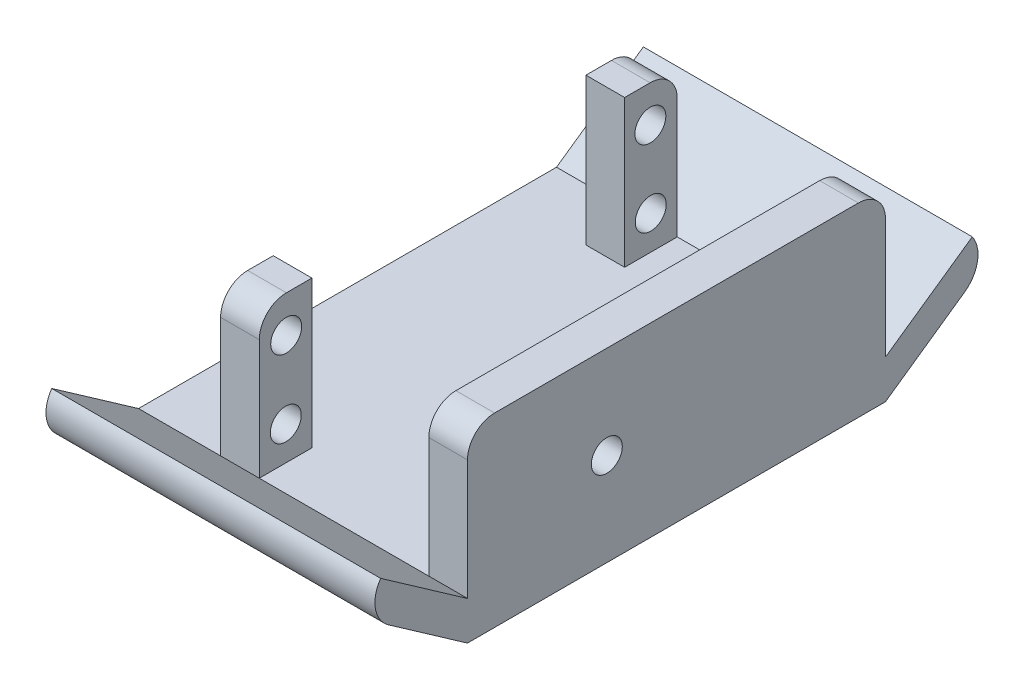
ISO-10303-21;
HEADER;
FILE_DESCRIPTION(('STEP AP214'),'2;1');
FILE_NAME('part.step','',(''),(''),'','','');
FILE_SCHEMA(('AUTOMOTIVE_DESIGN { 1 0 10303 214 1 1 1 1 }'));
ENDSEC;
DATA;
#1=APPLICATION_CONTEXT('core data for automotive mechanical design processes');
#2=APPLICATION_PROTOCOL_DEFINITION('international standard','automotive_design',2000,#1);
#3=PRODUCT_CONTEXT('',#1,'mechanical');
#4=PRODUCT('Part','Part','',(#3));
#5=PRODUCT_RELATED_PRODUCT_CATEGORY('part','',(#4));
#6=PRODUCT_DEFINITION_FORMATION('','',#4);
#7=PRODUCT_DEFINITION_CONTEXT('part definition',#1,'design');
#8=PRODUCT_DEFINITION('design','',#6,#7);
#9=PRODUCT_DEFINITION_SHAPE('','',#8);
#10=(LENGTH_UNIT() NAMED_UNIT(*) SI_UNIT(.MILLI.,.METRE.));
#11=(NAMED_UNIT(*) PLANE_ANGLE_UNIT() SI_UNIT($,.RADIAN.));
#12=(NAMED_UNIT(*) SI_UNIT($,.STERADIAN.) SOLID_ANGLE_UNIT());
#13=UNCERTAINTY_MEASURE_WITH_UNIT(LENGTH_MEASURE(1.E-05),#10,'distance_accuracy_value','');
#14=(GEOMETRIC_REPRESENTATION_CONTEXT(3) GLOBAL_UNCERTAINTY_ASSIGNED_CONTEXT((#13)) GLOBAL_UNIT_ASSIGNED_CONTEXT((#10,
#11,#12)) REPRESENTATION_CONTEXT('',''));
#15=CARTESIAN_POINT('',(0.,0.,0.));
#16=DIRECTION('',(0.,0.,1.));
#17=DIRECTION('',(1.,0.,0.));
#18=AXIS2_PLACEMENT_3D('',#15,#16,#17);
#19=CARTESIAN_POINT('',(31.9,-5.,-6.8));
#20=DIRECTION('',(0.,0.,-1.));
#21=DIRECTION('',(-1.,0.,0.));
#22=AXIS2_PLACEMENT_3D('',#19,#20,#21);
#23=PLANE('',#22);
#24=DIRECTION('',(-1.,0.,0.));
#25=VECTOR('',#24,1.);
#26=CARTESIAN_POINT('',(31.9,0.,-6.8));
#27=LINE('',#26,#25);
#28=CARTESIAN_POINT('',(5.00000000000001,0.,-6.8));
#29=VERTEX_POINT('',#28);
#30=CARTESIAN_POINT('',(0.,0.,-6.8));
#31=VERTEX_POINT('',#30);
#32=EDGE_CURVE('E207',#29,#31,#27,.T.);
#33=ORIENTED_EDGE('',*,*,#32,.T.);
#34=DIRECTION('',(0.,-1.,0.));
#35=VECTOR('',#34,1.);
#36=CARTESIAN_POINT('',(0.,19.,-6.8));
#37=LINE('',#36,#35);
#38=CARTESIAN_POINT('',(0.,15.5,-6.8));
#39=VERTEX_POINT('',#38);
#40=EDGE_CURVE('E295',#39,#31,#37,.T.);
#41=ORIENTED_EDGE('',*,*,#40,.F.);
#42=DIRECTION('',(-1.,0.,0.));
#43=VECTOR('',#42,1.);
#44=CARTESIAN_POINT('',(31.9,15.5,-6.8));
#45=LINE('',#44,#43);
#46=CARTESIAN_POINT('',(5.00000000000001,15.5,-6.8));
#47=VERTEX_POINT('',#46);
#48=EDGE_CURVE('E332',#39,#47,#45,.F.);
#49=ORIENTED_EDGE('',*,*,#48,.T.);
#50=DIRECTION('',(0.,-1.,0.));
#51=VECTOR('',#50,1.);
#52=CARTESIAN_POINT('',(5.00000000000001,19.,-6.8));
#53=LINE('',#52,#51);
#54=EDGE_CURVE('E280',#47,#29,#53,.T.);
#55=ORIENTED_EDGE('',*,*,#54,.T.);
#56=EDGE_LOOP('',(#33,#41,#49,#55));
#57=FACE_BOUND('',#56,.T.);
#58=ADVANCED_FACE('F33',(#57),#23,.T.);
#59=CARTESIAN_POINT('',(31.9,-5.,47.2));
#60=DIRECTION('',(0.,0.,1.));
#61=DIRECTION('',(1.,0.,0.));
#62=AXIS2_PLACEMENT_3D('',#59,#60,#61);
#63=PLANE('',#62);
#64=DIRECTION('',(-1.,0.,0.));
#65=VECTOR('',#64,1.);
#66=CARTESIAN_POINT('',(31.9,0.,47.2));
#67=LINE('',#66,#65);
#68=CARTESIAN_POINT('',(31.9,0.,47.2));
#69=VERTEX_POINT('',#68);
#70=CARTESIAN_POINT('',(26.9,0.,47.2));
#71=VERTEX_POINT('',#70);
#72=EDGE_CURVE('E226',#69,#71,#67,.T.);
#73=ORIENTED_EDGE('',*,*,#72,.F.);
#74=DIRECTION('',(0.,1.,0.));
#75=VECTOR('',#74,1.);
#76=CARTESIAN_POINT('',(31.9,-5.,47.2));
#77=LINE('',#76,#75);
#78=CARTESIAN_POINT('',(31.9,15.5,47.2));
#79=VERTEX_POINT('',#78);
#80=EDGE_CURVE('E319',#69,#79,#77,.T.);
#81=ORIENTED_EDGE('',*,*,#80,.T.);
#82=DIRECTION('',(1.,0.,0.));
#83=VECTOR('',#82,1.);
#84=CARTESIAN_POINT('',(26.9,15.5,47.2));
#85=LINE('',#84,#83);
#86=CARTESIAN_POINT('',(26.9,15.5,47.2));
#87=VERTEX_POINT('',#86);
#88=EDGE_CURVE('E354',#79,#87,#85,.F.);
#89=ORIENTED_EDGE('',*,*,#88,.T.);
#90=DIRECTION('',(0.,-1.,0.));
#91=VECTOR('',#90,1.);
#92=CARTESIAN_POINT('',(26.9,19.,47.2));
#93=LINE('',#92,#91);
#94=EDGE_CURVE('E239',#87,#71,#93,.T.);
#95=ORIENTED_EDGE('',*,*,#94,.T.);
#96=EDGE_LOOP('',(#73,#81,#89,#95));
#97=FACE_BOUND('',#96,.T.);
#98=ADVANCED_FACE('F436',(#97),#63,.T.);
#99=CARTESIAN_POINT('',(0.,0.,0.));
#100=DIRECTION('',(0.,1.,0.));
#101=DIRECTION('',(0.,0.,1.));
#102=AXIS2_PLACEMENT_3D('',#99,#100,#101);
#103=PLANE('',#102);
#104=DIRECTION('',(1.,0.,0.));
#105=VECTOR('',#104,1.);
#106=CARTESIAN_POINT('',(31.9,0.,47.2));
#107=LINE('',#106,#105);
#108=CARTESIAN_POINT('',(5.00000000000001,0.,47.2));
#109=VERTEX_POINT('',#108);
#110=EDGE_CURVE('E316',#109,#71,#107,.T.);
#111=ORIENTED_EDGE('',*,*,#110,.T.);
#112=DIRECTION('',(0.,0.,1.));
#113=VECTOR('',#112,1.);
#114=CARTESIAN_POINT('',(26.9,0.,-6.8));
#115=LINE('',#114,#113);
#116=CARTESIAN_POINT('',(26.9,0.,-6.8));
#117=VERTEX_POINT('',#116);
#118=EDGE_CURVE('E229',#117,#71,#115,.T.);
#119=ORIENTED_EDGE('',*,*,#118,.F.);
#120=DIRECTION('',(-1.,0.,0.));
#121=VECTOR('',#120,1.);
#122=CARTESIAN_POINT('',(31.9,0.,-6.8));
#123=LINE('',#122,#121);
#124=EDGE_CURVE('E311',#117,#29,#123,.T.);
#125=ORIENTED_EDGE('',*,*,#124,.T.);
#126=DIRECTION('',(0.,0.,-1.));
#127=VECTOR('',#126,1.);
#128=CARTESIAN_POINT('',(5.00000000000001,0.,0.));
#129=LINE('',#128,#127);
#130=CARTESIAN_POINT('',(5.00000000000001,0.,0.));
#131=VERTEX_POINT('',#130);
#132=EDGE_CURVE('E275',#131,#29,#129,.T.);
#133=ORIENTED_EDGE('',*,*,#132,.F.);
#134=DIRECTION('',(1.,0.,0.));
#135=VECTOR('',#134,1.);
#136=CARTESIAN_POINT('',(0.,0.,0.));
#137=LINE('',#136,#135);
#138=CARTESIAN_POINT('',(0.,0.,0.));
#139=VERTEX_POINT('',#138);
#140=EDGE_CURVE('E283',#139,#131,#137,.T.);
#141=ORIENTED_EDGE('',*,*,#140,.F.);
#142=DIRECTION('',(0.,0.,1.));
#143=VECTOR('',#142,1.);
#144=CARTESIAN_POINT('',(0.,0.,0.));
#145=LINE('',#144,#143);
#146=EDGE_CURVE('E271',#31,#139,#145,.T.);
#147=ORIENTED_EDGE('',*,*,#146,.F.);
#148=CARTESIAN_POINT('',(-10.6,0.,-6.8));
#149=VERTEX_POINT('',#148);
#150=EDGE_CURVE('E298',#31,#149,#123,.T.);
#151=ORIENTED_EDGE('',*,*,#150,.T.);
#152=DIRECTION('',(0.,0.,1.));
#153=VECTOR('',#152,1.);
#154=CARTESIAN_POINT('',(-10.6,0.,47.2));
#155=LINE('',#154,#153);
#156=CARTESIAN_POINT('',(-10.6,0.,47.2));
#157=VERTEX_POINT('',#156);
#158=EDGE_CURVE('E314',#149,#157,#155,.T.);
#159=ORIENTED_EDGE('',*,*,#158,.T.);
#160=CARTESIAN_POINT('',(0.,0.,47.2));
#161=VERTEX_POINT('',#160);
#162=EDGE_CURVE('E302',#157,#161,#107,.T.);
#163=ORIENTED_EDGE('',*,*,#162,.T.);
#164=DIRECTION('',(0.,0.,1.));
#165=VECTOR('',#164,1.);
#166=CARTESIAN_POINT('',(0.,0.,40.4));
#167=LINE('',#166,#165);
#168=CARTESIAN_POINT('',(0.,0.,40.4));
#169=VERTEX_POINT('',#168);
#170=EDGE_CURVE('E246',#169,#161,#167,.T.);
#171=ORIENTED_EDGE('',*,*,#170,.F.);
#172=DIRECTION('',(-1.,0.,0.));
#173=VECTOR('',#172,1.);
#174=CARTESIAN_POINT('',(0.,0.,40.4));
#175=LINE('',#174,#173);
#176=CARTESIAN_POINT('',(5.00000000000001,0.,40.4));
#177=VERTEX_POINT('',#176);
#178=EDGE_CURVE('E251',#177,#169,#175,.T.);
#179=ORIENTED_EDGE('',*,*,#178,.F.);
#180=DIRECTION('',(0.,0.,-1.));
#181=VECTOR('',#180,1.);
#182=CARTESIAN_POINT('',(5.00000000000001,0.,40.4));
#183=LINE('',#182,#181);
#184=EDGE_CURVE('E258',#109,#177,#183,.T.);
#185=ORIENTED_EDGE('',*,*,#184,.F.);
#186=EDGE_LOOP('',(#111,#119,#125,#133,#141,#147,#151,#159,#163,#171,#179,#185));
#187=FACE_BOUND('',#186,.T.);
#188=ADVANCED_FACE('F385',(#187),#103,.T.);
#189=CARTESIAN_POINT('',(31.9,-5.,47.2));
#190=DIRECTION('',(1.,0.,0.));
#191=DIRECTION('',(0.,0.,-1.));
#192=AXIS2_PLACEMENT_3D('',#189,#190,#191);
#193=PLANE('',#192);
#194=CARTESIAN_POINT('',(31.9,7.,29.2));
#195=DIRECTION('',(1.,0.,0.));
#196=DIRECTION('',(0.,0.,-1.));
#197=AXIS2_PLACEMENT_3D('',#194,#195,#196);
#198=CIRCLE('',#197,2.);
#199=CARTESIAN_POINT('',(31.9,7.,27.2));
#200=VERTEX_POINT('',#199);
#201=EDGE_CURVE('E420',#200,#200,#198,.T.);
#202=ORIENTED_EDGE('',*,*,#201,.F.);
#203=EDGE_LOOP('',(#202));
#204=FACE_BOUND('',#203,.T.);
#205=DIRECTION('',(0.,-0.57357643635105,-0.819152044288989));
#206=VECTOR('',#205,1.);
#207=CARTESIAN_POINT('',(31.9,7.85505035831426,58.4181745120853));
#208=LINE('',#207,#206);
#209=CARTESIAN_POINT('',(31.9,7.85505035831426,58.4181745120853));
#210=VERTEX_POINT('',#209);
#211=EDGE_CURVE('E216',#210,#69,#208,.T.);
#212=ORIENTED_EDGE('',*,*,#211,.F.);
#213=CARTESIAN_POINT('',(31.9,5.50686124991796,55.0572210891398));
#214=DIRECTION('',(1.,0.,0.));
#215=DIRECTION('',(0.,0.,-1.));
#216=AXIS2_PLACEMENT_3D('',#213,#214,#215);
#217=CIRCLE('',#216,4.1);
#218=CARTESIAN_POINT('',(31.9,2.14833786833309,57.4088844781791));
#219=VERTEX_POINT('',#218);
#220=EDGE_CURVE('E41',#210,#219,#217,.T.);
#221=ORIENTED_EDGE('',*,*,#220,.T.);
#222=DIRECTION('',(0.,0.573576436351044,0.819152044288993));
#223=VECTOR('',#222,1.);
#224=CARTESIAN_POINT('',(31.9,-5.,47.2));
#225=LINE('',#224,#223);
#226=CARTESIAN_POINT('',(31.9,-5.,47.2));
#227=VERTEX_POINT('',#226);
#228=EDGE_CURVE('E213',#227,#219,#225,.T.);
#229=ORIENTED_EDGE('',*,*,#228,.F.);
#230=DIRECTION('',(0.,0.,-1.));
#231=VECTOR('',#230,1.);
#232=CARTESIAN_POINT('',(31.9,-5.,47.2));
#233=LINE('',#232,#231);
#234=CARTESIAN_POINT('',(31.9,-5.,-6.8));
#235=VERTEX_POINT('',#234);
#236=EDGE_CURVE('E299',#227,#235,#233,.T.);
#237=ORIENTED_EDGE('',*,*,#236,.T.);
#238=DIRECTION('',(0.,-0.573576436351044,0.819152044288993));
#239=VECTOR('',#238,1.);
#240=CARTESIAN_POINT('',(31.9,-5.00000000000002,-6.8));
#241=LINE('',#240,#239);
#242=CARTESIAN_POINT('',(31.9,2.14833786833306,-17.0088844781791));
#243=VERTEX_POINT('',#242);
#244=EDGE_CURVE('E192',#243,#235,#241,.T.);
#245=ORIENTED_EDGE('',*,*,#244,.F.);
#246=CARTESIAN_POINT('',(31.9,5.50686124991794,-14.6572210891398));
#247=DIRECTION('',(1.,0.,0.));
#248=DIRECTION('',(0.,0.,-1.));
#249=AXIS2_PLACEMENT_3D('',#246,#247,#248);
#250=CIRCLE('',#249,4.1);
#251=CARTESIAN_POINT('',(31.9,7.85505035831424,-18.0181745120853));
#252=VERTEX_POINT('',#251);
#253=EDGE_CURVE('E186',#243,#252,#250,.T.);
#254=ORIENTED_EDGE('',*,*,#253,.T.);
#255=DIRECTION('',(0.,0.57357643635105,-0.819152044288989));
#256=VECTOR('',#255,1.);
#257=CARTESIAN_POINT('',(31.9,7.85505035831424,-18.0181745120853));
#258=LINE('',#257,#256);
#259=CARTESIAN_POINT('',(31.9,0.,-6.8));
#260=VERTEX_POINT('',#259);
#261=EDGE_CURVE('E190',#260,#252,#258,.T.);
#262=ORIENTED_EDGE('',*,*,#261,.F.);
#263=DIRECTION('',(0.,1.,0.));
#264=VECTOR('',#263,1.);
#265=CARTESIAN_POINT('',(31.9,-5.,-6.8));
#266=LINE('',#265,#264);
#267=CARTESIAN_POINT('',(31.9,15.5,-6.8));
#268=VERTEX_POINT('',#267);
#269=EDGE_CURVE('E310',#260,#268,#266,.T.);
#270=ORIENTED_EDGE('',*,*,#269,.T.);
#271=CARTESIAN_POINT('',(31.9,15.5,-3.3));
#272=DIRECTION('',(1.,0.,0.));
#273=DIRECTION('',(0.,0.,-1.));
#274=AXIS2_PLACEMENT_3D('',#271,#272,#273);
#275=CIRCLE('',#274,3.5);
#276=CARTESIAN_POINT('',(31.9,19.,-3.3));
#277=VERTEX_POINT('',#276);
#278=EDGE_CURVE('E340',#268,#277,#275,.T.);
#279=ORIENTED_EDGE('',*,*,#278,.T.);
#280=DIRECTION('',(0.,0.,-1.));
#281=VECTOR('',#280,1.);
#282=CARTESIAN_POINT('',(31.9,19.,-6.8));
#283=LINE('',#282,#281);
#284=CARTESIAN_POINT('',(31.9,19.,43.7));
#285=VERTEX_POINT('',#284);
#286=EDGE_CURVE('E233',#285,#277,#283,.T.);
#287=ORIENTED_EDGE('',*,*,#286,.F.);
#288=CARTESIAN_POINT('',(31.9,15.5,43.7));
#289=DIRECTION('',(1.,0.,0.));
#290=DIRECTION('',(0.,0.,-1.));
#291=AXIS2_PLACEMENT_3D('',#288,#289,#290);
#292=CIRCLE('',#291,3.5);
#293=EDGE_CURVE('E337',#285,#79,#292,.T.);
#294=ORIENTED_EDGE('',*,*,#293,.T.);
#295=ORIENTED_EDGE('',*,*,#80,.F.);
#296=EDGE_LOOP('',(#212,#221,#229,#237,#245,#254,#262,#270,#279,#287,#294,#295));
#297=FACE_BOUND('',#296,.T.);
#298=ADVANCED_FACE('F189',(#204,#297),#193,.T.);
#299=EDGE_CURVE('E230',#109,#161,#67,.T.);
#300=ORIENTED_EDGE('',*,*,#299,.F.);
#301=DIRECTION('',(0.,-1.,0.));
#302=VECTOR('',#301,1.);
#303=CARTESIAN_POINT('',(5.00000000000001,19.,47.2));
#304=LINE('',#303,#302);
#305=CARTESIAN_POINT('',(5.00000000000001,15.5,47.2));
#306=VERTEX_POINT('',#305);
#307=EDGE_CURVE('E266',#306,#109,#304,.T.);
#308=ORIENTED_EDGE('',*,*,#307,.F.);
#309=DIRECTION('',(1.,0.,0.));
#310=VECTOR('',#309,1.);
#311=CARTESIAN_POINT('',(31.9,15.5,47.2));
#312=LINE('',#311,#310);
#313=CARTESIAN_POINT('',(0.,15.5,47.2));
#314=VERTEX_POINT('',#313);
#315=EDGE_CURVE('E356',#306,#314,#312,.F.);
#316=ORIENTED_EDGE('',*,*,#315,.T.);
#317=DIRECTION('',(0.,-1.,0.));
#318=VECTOR('',#317,1.);
#319=CARTESIAN_POINT('',(0.,19.,47.2));
#320=LINE('',#319,#318);
#321=EDGE_CURVE('E269',#314,#161,#320,.T.);
#322=ORIENTED_EDGE('',*,*,#321,.T.);
#323=EDGE_LOOP('',(#300,#308,#316,#322));
#324=FACE_BOUND('',#323,.T.);
#325=ADVANCED_FACE('F428',(#324),#63,.T.);
#326=CARTESIAN_POINT('',(-10.6,-5.,47.2));
#327=DIRECTION('',(-1.,0.,0.));
#328=DIRECTION('',(0.,0.,1.));
#329=AXIS2_PLACEMENT_3D('',#326,#327,#328);
#330=PLANE('',#329);
#331=DIRECTION('',(0.,0.573576436351044,0.819152044288993));
#332=VECTOR('',#331,1.);
#333=CARTESIAN_POINT('',(-10.6,-5.,47.2));
#334=LINE('',#333,#332);
#335=CARTESIAN_POINT('',(-10.6,-5.,47.2));
#336=VERTEX_POINT('',#335);
#337=CARTESIAN_POINT('',(-10.6,2.14833786833309,57.4088844781791));
#338=VERTEX_POINT('',#337);
#339=EDGE_CURVE('E221',#336,#338,#334,.T.);
#340=ORIENTED_EDGE('',*,*,#339,.T.);
#341=CARTESIAN_POINT('',(-10.6,5.50686124991796,55.0572210891398));
#342=DIRECTION('',(-1.,0.,0.));
#343=DIRECTION('',(0.,0.,1.));
#344=AXIS2_PLACEMENT_3D('',#341,#342,#343);
#345=CIRCLE('',#344,4.1);
#346=CARTESIAN_POINT('',(-10.6,7.85505035831426,58.4181745120853));
#347=VERTEX_POINT('',#346);
#348=EDGE_CURVE('E195',#338,#347,#345,.T.);
#349=ORIENTED_EDGE('',*,*,#348,.T.);
#350=DIRECTION('',(0.,-0.57357643635105,-0.819152044288989));
#351=VECTOR('',#350,1.);
#352=CARTESIAN_POINT('',(-10.6,7.85505035831426,58.4181745120853));
#353=LINE('',#352,#351);
#354=EDGE_CURVE('E217',#347,#157,#353,.T.);
#355=ORIENTED_EDGE('',*,*,#354,.T.);
#356=ORIENTED_EDGE('',*,*,#158,.F.);
#357=DIRECTION('',(0.,0.57357643635105,-0.819152044288989));
#358=VECTOR('',#357,1.);
#359=CARTESIAN_POINT('',(-10.6,7.85505035831424,-18.0181745120853));
#360=LINE('',#359,#358);
#361=CARTESIAN_POINT('',(-10.6,7.85505035831424,-18.0181745120853));
#362=VERTEX_POINT('',#361);
#363=EDGE_CURVE('E389',#149,#362,#360,.T.);
#364=ORIENTED_EDGE('',*,*,#363,.T.);
#365=CARTESIAN_POINT('',(-10.6,5.50686124991794,-14.6572210891398));
#366=DIRECTION('',(-1.,0.,0.));
#367=DIRECTION('',(0.,0.,1.));
#368=AXIS2_PLACEMENT_3D('',#365,#366,#367);
#369=CIRCLE('',#368,4.1);
#370=CARTESIAN_POINT('',(-10.6,2.14833786833307,-17.0088844781791));
#371=VERTEX_POINT('',#370);
#372=EDGE_CURVE('E54',#362,#371,#369,.T.);
#373=ORIENTED_EDGE('',*,*,#372,.T.);
#374=DIRECTION('',(0.,-0.573576436351044,0.819152044288993));
#375=VECTOR('',#374,1.);
#376=CARTESIAN_POINT('',(-10.6,-5.00000000000002,-6.8));
#377=LINE('',#376,#375);
#378=CARTESIAN_POINT('',(-10.6,-5.00000000000002,-6.8));
#379=VERTEX_POINT('',#378);
#380=EDGE_CURVE('E205',#371,#379,#377,.T.);
#381=ORIENTED_EDGE('',*,*,#380,.T.);
#382=DIRECTION('',(0.,0.,1.));
#383=VECTOR('',#382,1.);
#384=CARTESIAN_POINT('',(-10.6,-5.,47.2));
#385=LINE('',#384,#383);
#386=EDGE_CURVE('E305',#379,#336,#385,.T.);
#387=ORIENTED_EDGE('',*,*,#386,.T.);
#388=EDGE_LOOP('',(#340,#349,#355,#356,#364,#373,#381,#387));
#389=FACE_BOUND('',#388,.T.);
#390=ADVANCED_FACE('F375',(#389),#330,.T.);
#391=EDGE_CURVE('E204',#260,#117,#27,.T.);
#392=ORIENTED_EDGE('',*,*,#391,.T.);
#393=DIRECTION('',(0.,-1.,0.));
#394=VECTOR('',#393,1.);
#395=CARTESIAN_POINT('',(26.9,19.,-6.8));
#396=LINE('',#395,#394);
#397=CARTESIAN_POINT('',(26.9,15.5,-6.8));
#398=VERTEX_POINT('',#397);
#399=EDGE_CURVE('E243',#398,#117,#396,.T.);
#400=ORIENTED_EDGE('',*,*,#399,.F.);
#401=DIRECTION('',(-1.,0.,0.));
#402=VECTOR('',#401,1.);
#403=CARTESIAN_POINT('',(31.9,15.5,-6.8));
#404=LINE('',#403,#402);
#405=EDGE_CURVE('E334',#398,#268,#404,.F.);
#406=ORIENTED_EDGE('',*,*,#405,.T.);
#407=ORIENTED_EDGE('',*,*,#269,.F.);
#408=EDGE_LOOP('',(#392,#400,#406,#407));
#409=FACE_BOUND('',#408,.T.);
#410=ADVANCED_FACE('F442',(#409),#23,.T.);
#411=CARTESIAN_POINT('',(0.,-5.,0.));
#412=DIRECTION('',(0.,1.,0.));
#413=DIRECTION('',(0.,0.,1.));
#414=AXIS2_PLACEMENT_3D('',#411,#412,#413);
#415=PLANE('',#414);
#416=ORIENTED_EDGE('',*,*,#236,.F.);
#417=DIRECTION('',(1.,0.,0.));
#418=VECTOR('',#417,1.);
#419=CARTESIAN_POINT('',(31.9,-5.,47.2));
#420=LINE('',#419,#418);
#421=EDGE_CURVE('E307',#336,#227,#420,.T.);
#422=ORIENTED_EDGE('',*,*,#421,.F.);
#423=ORIENTED_EDGE('',*,*,#386,.F.);
#424=DIRECTION('',(-1.,0.,0.));
#425=VECTOR('',#424,1.);
#426=CARTESIAN_POINT('',(31.9,-5.,-6.8));
#427=LINE('',#426,#425);
#428=EDGE_CURVE('E301',#235,#379,#427,.T.);
#429=ORIENTED_EDGE('',*,*,#428,.F.);
#430=EDGE_LOOP('',(#416,#422,#423,#429));
#431=FACE_BOUND('',#430,.T.);
#432=ADVANCED_FACE('F449',(#431),#415,.F.);
#433=CARTESIAN_POINT('',(0.,19.,0.));
#434=DIRECTION('',(1.,0.,0.));
#435=DIRECTION('',(0.,0.,-1.));
#436=AXIS2_PLACEMENT_3D('',#433,#434,#435);
#437=PLANE('',#436);
#438=CARTESIAN_POINT('',(0.,4.35890483515786,-3.37705839560443));
#439=DIRECTION('',(-1.,0.,0.));
#440=DIRECTION('',(0.,0.,1.));
#441=AXIS2_PLACEMENT_3D('',#438,#439,#440);
#442=CIRCLE('',#441,2.);
#443=CARTESIAN_POINT('',(0.,4.35890483515786,-1.37705839560443));
#444=VERTEX_POINT('',#443);
#445=EDGE_CURVE('E407',#444,#444,#442,.T.);
#446=ORIENTED_EDGE('',*,*,#445,.F.);
#447=EDGE_LOOP('',(#446));
#448=FACE_BOUND('',#447,.T.);
#449=CARTESIAN_POINT('',(0.,14.2589048351579,-3.32495313244653));
#450=DIRECTION('',(-1.,0.,0.));
#451=DIRECTION('',(0.,0.,1.));
#452=AXIS2_PLACEMENT_3D('',#449,#450,#451);
#453=CIRCLE('',#452,2.);
#454=CARTESIAN_POINT('',(0.,14.2589048351579,-1.32495313244653));
#455=VERTEX_POINT('',#454);
#456=EDGE_CURVE('E394',#455,#455,#453,.T.);
#457=ORIENTED_EDGE('',*,*,#456,.F.);
#458=EDGE_LOOP('',(#457));
#459=FACE_BOUND('',#458,.T.);
#460=DIRECTION('',(0.,0.,1.));
#461=VECTOR('',#460,1.);
#462=CARTESIAN_POINT('',(0.,19.,0.));
#463=LINE('',#462,#461);
#464=CARTESIAN_POINT('',(0.,19.,-3.3));
#465=VERTEX_POINT('',#464);
#466=CARTESIAN_POINT('',(0.,19.,0.));
#467=VERTEX_POINT('',#466);
#468=EDGE_CURVE('E272',#465,#467,#463,.T.);
#469=ORIENTED_EDGE('',*,*,#468,.F.);
#470=CARTESIAN_POINT('',(0.,15.5,-3.3));
#471=DIRECTION('',(1.,0.,0.));
#472=DIRECTION('',(0.,0.,-1.));
#473=AXIS2_PLACEMENT_3D('',#470,#471,#472);
#474=CIRCLE('',#473,3.5);
#475=EDGE_CURVE('E345',#465,#39,#474,.F.);
#476=ORIENTED_EDGE('',*,*,#475,.T.);
#477=ORIENTED_EDGE('',*,*,#40,.T.);
#478=ORIENTED_EDGE('',*,*,#146,.T.);
#479=DIRECTION('',(0.,-1.,0.));
#480=VECTOR('',#479,1.);
#481=CARTESIAN_POINT('',(0.,19.,0.));
#482=LINE('',#481,#480);
#483=EDGE_CURVE('E292',#467,#139,#482,.T.);
#484=ORIENTED_EDGE('',*,*,#483,.F.);
#485=EDGE_LOOP('',(#469,#476,#477,#478,#484));
#486=FACE_BOUND('',#485,.T.);
#487=ADVANCED_FACE('F455',(#448,#459,#486),#437,.F.);
#488=CARTESIAN_POINT('',(0.,19.,0.));
#489=DIRECTION('',(0.,0.,-1.));
#490=DIRECTION('',(-1.,0.,0.));
#491=AXIS2_PLACEMENT_3D('',#488,#489,#490);
#492=PLANE('',#491);
#493=ORIENTED_EDGE('',*,*,#140,.T.);
#494=DIRECTION('',(0.,-1.,0.));
#495=VECTOR('',#494,1.);
#496=CARTESIAN_POINT('',(5.00000000000001,19.,0.));
#497=LINE('',#496,#495);
#498=CARTESIAN_POINT('',(5.00000000000001,19.,0.));
#499=VERTEX_POINT('',#498);
#500=EDGE_CURVE('E289',#499,#131,#497,.T.);
#501=ORIENTED_EDGE('',*,*,#500,.F.);
#502=DIRECTION('',(1.,0.,0.));
#503=VECTOR('',#502,1.);
#504=CARTESIAN_POINT('',(0.,19.,0.));
#505=LINE('',#504,#503);
#506=EDGE_CURVE('E274',#467,#499,#505,.T.);
#507=ORIENTED_EDGE('',*,*,#506,.F.);
#508=ORIENTED_EDGE('',*,*,#483,.T.);
#509=EDGE_LOOP('',(#493,#501,#507,#508));
#510=FACE_BOUND('',#509,.T.);
#511=ADVANCED_FACE('F474',(#510),#492,.F.);
#512=CARTESIAN_POINT('',(5.00000000000001,19.,0.));
#513=DIRECTION('',(-1.,0.,0.));
#514=DIRECTION('',(0.,0.,1.));
#515=AXIS2_PLACEMENT_3D('',#512,#513,#514);
#516=PLANE('',#515);
#517=CARTESIAN_POINT('',(5.,4.35890483515786,-3.37705839560443));
#518=DIRECTION('',(-1.,0.,0.));
#519=DIRECTION('',(0.,0.,1.));
#520=AXIS2_PLACEMENT_3D('',#517,#518,#519);
#521=CIRCLE('',#520,2.);
#522=CARTESIAN_POINT('',(5.,4.35890483515786,-1.37705839560443));
#523=VERTEX_POINT('',#522);
#524=EDGE_CURVE('E398',#523,#523,#521,.T.);
#525=ORIENTED_EDGE('',*,*,#524,.T.);
#526=EDGE_LOOP('',(#525));
#527=FACE_BOUND('',#526,.T.);
#528=CARTESIAN_POINT('',(5.,14.2589048351579,-3.32495313244653));
#529=DIRECTION('',(-1.,0.,0.));
#530=DIRECTION('',(0.,0.,1.));
#531=AXIS2_PLACEMENT_3D('',#528,#529,#530);
#532=CIRCLE('',#531,2.);
#533=CARTESIAN_POINT('',(5.,14.2589048351579,-1.32495313244653));
#534=VERTEX_POINT('',#533);
#535=EDGE_CURVE('E391',#534,#534,#532,.T.);
#536=ORIENTED_EDGE('',*,*,#535,.T.);
#537=EDGE_LOOP('',(#536));
#538=FACE_BOUND('',#537,.T.);
#539=ORIENTED_EDGE('',*,*,#54,.F.);
#540=CARTESIAN_POINT('',(5.00000000000001,15.5,-3.3));
#541=DIRECTION('',(-1.,0.,0.));
#542=DIRECTION('',(0.,0.,1.));
#543=AXIS2_PLACEMENT_3D('',#540,#541,#542);
#544=CIRCLE('',#543,3.5);
#545=CARTESIAN_POINT('',(5.00000000000001,19.,-3.3));
#546=VERTEX_POINT('',#545);
#547=EDGE_CURVE('E347',#47,#546,#544,.F.);
#548=ORIENTED_EDGE('',*,*,#547,.T.);
#549=DIRECTION('',(0.,0.,-1.));
#550=VECTOR('',#549,1.);
#551=CARTESIAN_POINT('',(5.00000000000001,19.,0.));
#552=LINE('',#551,#550);
#553=EDGE_CURVE('E277',#499,#546,#552,.T.);
#554=ORIENTED_EDGE('',*,*,#553,.F.);
#555=ORIENTED_EDGE('',*,*,#500,.T.);
#556=ORIENTED_EDGE('',*,*,#132,.T.);
#557=EDGE_LOOP('',(#539,#548,#554,#555,#556));
#558=FACE_BOUND('',#557,.T.);
#559=ADVANCED_FACE('F478',(#527,#538,#558),#516,.F.);
#560=CARTESIAN_POINT('',(0.,19.,0.));
#561=DIRECTION('',(0.,1.,0.));
#562=DIRECTION('',(0.,0.,1.));
#563=AXIS2_PLACEMENT_3D('',#560,#561,#562);
#564=PLANE('',#563);
#565=ORIENTED_EDGE('',*,*,#553,.T.);
#566=DIRECTION('',(-1.,0.,0.));
#567=VECTOR('',#566,1.);
#568=CARTESIAN_POINT('',(0.,19.,-3.3));
#569=LINE('',#568,#567);
#570=EDGE_CURVE('E342',#546,#465,#569,.T.);
#571=ORIENTED_EDGE('',*,*,#570,.T.);
#572=ORIENTED_EDGE('',*,*,#468,.T.);
#573=ORIENTED_EDGE('',*,*,#506,.T.);
#574=EDGE_LOOP('',(#565,#571,#572,#573));
#575=FACE_BOUND('',#574,.T.);
#576=ADVANCED_FACE('F482',(#575),#564,.T.);
#577=CARTESIAN_POINT('',(0.,19.,40.4));
#578=DIRECTION('',(1.,0.,0.));
#579=DIRECTION('',(0.,0.,-1.));
#580=AXIS2_PLACEMENT_3D('',#577,#578,#579);
#581=PLANE('',#580);
#582=CARTESIAN_POINT('',(0.,14.2589048351579,43.7249531324465));
#583=DIRECTION('',(-1.,0.,0.));
#584=DIRECTION('',(0.,0.,1.));
#585=AXIS2_PLACEMENT_3D('',#582,#583,#584);
#586=CIRCLE('',#585,2.);
#587=CARTESIAN_POINT('',(0.,14.2589048351579,45.7249531324465));
#588=VERTEX_POINT('',#587);
#589=EDGE_CURVE('E400',#588,#588,#586,.T.);
#590=ORIENTED_EDGE('',*,*,#589,.F.);
#591=EDGE_LOOP('',(#590));
#592=FACE_BOUND('',#591,.T.);
#593=CARTESIAN_POINT('',(0.,4.35890483515786,43.7770583956044));
#594=DIRECTION('',(-1.,0.,0.));
#595=DIRECTION('',(0.,0.,1.));
#596=AXIS2_PLACEMENT_3D('',#593,#594,#595);
#597=CIRCLE('',#596,2.);
#598=CARTESIAN_POINT('',(0.,4.35890483515786,45.7770583956044));
#599=VERTEX_POINT('',#598);
#600=EDGE_CURVE('E412',#599,#599,#597,.T.);
#601=ORIENTED_EDGE('',*,*,#600,.F.);
#602=EDGE_LOOP('',(#601));
#603=FACE_BOUND('',#602,.T.);
#604=ORIENTED_EDGE('',*,*,#321,.F.);
#605=CARTESIAN_POINT('',(0.,15.5,43.7));
#606=DIRECTION('',(1.,0.,0.));
#607=DIRECTION('',(0.,0.,-1.));
#608=AXIS2_PLACEMENT_3D('',#605,#606,#607);
#609=CIRCLE('',#608,3.5);
#610=CARTESIAN_POINT('',(0.,19.,43.7));
#611=VERTEX_POINT('',#610);
#612=EDGE_CURVE('E358',#314,#611,#609,.F.);
#613=ORIENTED_EDGE('',*,*,#612,.T.);
#614=DIRECTION('',(0.,0.,1.));
#615=VECTOR('',#614,1.);
#616=CARTESIAN_POINT('',(0.,19.,40.4));
#617=LINE('',#616,#615);
#618=CARTESIAN_POINT('',(0.,19.,40.4));
#619=VERTEX_POINT('',#618);
#620=EDGE_CURVE('E247',#619,#611,#617,.T.);
#621=ORIENTED_EDGE('',*,*,#620,.F.);
#622=DIRECTION('',(0.,-1.,0.));
#623=VECTOR('',#622,1.);
#624=CARTESIAN_POINT('',(0.,19.,40.4));
#625=LINE('',#624,#623);
#626=EDGE_CURVE('E255',#619,#169,#625,.T.);
#627=ORIENTED_EDGE('',*,*,#626,.T.);
#628=ORIENTED_EDGE('',*,*,#170,.T.);
#629=EDGE_LOOP('',(#604,#613,#621,#627,#628));
#630=FACE_BOUND('',#629,.T.);
#631=ADVANCED_FACE('F538',(#592,#603,#630),#581,.F.);
#632=CARTESIAN_POINT('',(5.00000000000001,19.,40.4));
#633=DIRECTION('',(-1.,0.,0.));
#634=DIRECTION('',(0.,0.,1.));
#635=AXIS2_PLACEMENT_3D('',#632,#633,#634);
#636=PLANE('',#635);
#637=CARTESIAN_POINT('',(5.,14.2589048351579,43.7249531324465));
#638=DIRECTION('',(-1.,0.,0.));
#639=DIRECTION('',(0.,0.,1.));
#640=AXIS2_PLACEMENT_3D('',#637,#638,#639);
#641=CIRCLE('',#640,2.);
#642=CARTESIAN_POINT('',(5.,14.2589048351579,45.7249531324465));
#643=VERTEX_POINT('',#642);
#644=EDGE_CURVE('E403',#643,#643,#641,.T.);
#645=ORIENTED_EDGE('',*,*,#644,.T.);
#646=EDGE_LOOP('',(#645));
#647=FACE_BOUND('',#646,.T.);
#648=CARTESIAN_POINT('',(5.,4.35890483515786,43.7770583956044));
#649=DIRECTION('',(-1.,0.,0.));
#650=DIRECTION('',(0.,0.,1.));
#651=AXIS2_PLACEMENT_3D('',#648,#649,#650);
#652=CIRCLE('',#651,2.);
#653=CARTESIAN_POINT('',(5.,4.35890483515786,45.7770583956044));
#654=VERTEX_POINT('',#653);
#655=EDGE_CURVE('E404',#654,#654,#652,.T.);
#656=ORIENTED_EDGE('',*,*,#655,.T.);
#657=EDGE_LOOP('',(#656));
#658=FACE_BOUND('',#657,.T.);
#659=DIRECTION('',(0.,0.,-1.));
#660=VECTOR('',#659,1.);
#661=CARTESIAN_POINT('',(5.00000000000001,19.,40.4));
#662=LINE('',#661,#660);
#663=CARTESIAN_POINT('',(5.00000000000001,19.,43.7));
#664=VERTEX_POINT('',#663);
#665=CARTESIAN_POINT('',(5.00000000000001,19.,40.4));
#666=VERTEX_POINT('',#665);
#667=EDGE_CURVE('E250',#664,#666,#662,.T.);
#668=ORIENTED_EDGE('',*,*,#667,.F.);
#669=CARTESIAN_POINT('',(5.00000000000001,15.5,43.7));
#670=DIRECTION('',(-1.,0.,0.));
#671=DIRECTION('',(0.,0.,1.));
#672=AXIS2_PLACEMENT_3D('',#669,#670,#671);
#673=CIRCLE('',#672,3.5);
#674=EDGE_CURVE('E352',#664,#306,#673,.F.);
#675=ORIENTED_EDGE('',*,*,#674,.T.);
#676=ORIENTED_EDGE('',*,*,#307,.T.);
#677=ORIENTED_EDGE('',*,*,#184,.T.);
#678=DIRECTION('',(0.,-1.,0.));
#679=VECTOR('',#678,1.);
#680=CARTESIAN_POINT('',(5.00000000000001,19.,40.4));
#681=LINE('',#680,#679);
#682=EDGE_CURVE('E264',#666,#177,#681,.T.);
#683=ORIENTED_EDGE('',*,*,#682,.F.);
#684=EDGE_LOOP('',(#668,#675,#676,#677,#683));
#685=FACE_BOUND('',#684,.T.);
#686=ADVANCED_FACE('F534',(#647,#658,#685),#636,.F.);
#687=CARTESIAN_POINT('',(0.,19.,40.4));
#688=DIRECTION('',(0.,0.,1.));
#689=DIRECTION('',(1.,0.,0.));
#690=AXIS2_PLACEMENT_3D('',#687,#688,#689);
#691=PLANE('',#690);
#692=ORIENTED_EDGE('',*,*,#178,.T.);
#693=ORIENTED_EDGE('',*,*,#626,.F.);
#694=DIRECTION('',(-1.,0.,0.));
#695=VECTOR('',#694,1.);
#696=CARTESIAN_POINT('',(0.,19.,40.4));
#697=LINE('',#696,#695);
#698=EDGE_CURVE('E253',#666,#619,#697,.T.);
#699=ORIENTED_EDGE('',*,*,#698,.F.);
#700=ORIENTED_EDGE('',*,*,#682,.T.);
#701=EDGE_LOOP('',(#692,#693,#699,#700));
#702=FACE_BOUND('',#701,.T.);
#703=ADVANCED_FACE('F530',(#702),#691,.F.);
#704=CARTESIAN_POINT('',(0.,19.,0.));
#705=DIRECTION('',(0.,1.,0.));
#706=DIRECTION('',(0.,0.,1.));
#707=AXIS2_PLACEMENT_3D('',#704,#705,#706);
#708=PLANE('',#707);
#709=ORIENTED_EDGE('',*,*,#620,.T.);
#710=DIRECTION('',(1.,0.,0.));
#711=VECTOR('',#710,1.);
#712=CARTESIAN_POINT('',(0.,19.,43.7));
#713=LINE('',#712,#711);
#714=EDGE_CURVE('E349',#611,#664,#713,.T.);
#715=ORIENTED_EDGE('',*,*,#714,.T.);
#716=ORIENTED_EDGE('',*,*,#667,.T.);
#717=ORIENTED_EDGE('',*,*,#698,.T.);
#718=EDGE_LOOP('',(#709,#715,#716,#717));
#719=FACE_BOUND('',#718,.T.);
#720=ADVANCED_FACE('F526',(#719),#708,.T.);
#721=CARTESIAN_POINT('',(26.9,19.,-6.8));
#722=DIRECTION('',(1.,0.,0.));
#723=DIRECTION('',(0.,0.,-1.));
#724=AXIS2_PLACEMENT_3D('',#721,#722,#723);
#725=PLANE('',#724);
#726=CARTESIAN_POINT('',(26.9,7.,29.2));
#727=DIRECTION('',(1.,0.,0.));
#728=DIRECTION('',(0.,0.,-1.));
#729=AXIS2_PLACEMENT_3D('',#726,#727,#728);
#730=CIRCLE('',#729,2.);
#731=CARTESIAN_POINT('',(26.9,7.,27.2));
#732=VERTEX_POINT('',#731);
#733=EDGE_CURVE('E415',#732,#732,#730,.F.);
#734=ORIENTED_EDGE('',*,*,#733,.F.);
#735=EDGE_LOOP('',(#734));
#736=FACE_BOUND('',#735,.T.);
#737=DIRECTION('',(0.,0.,1.));
#738=VECTOR('',#737,1.);
#739=CARTESIAN_POINT('',(26.9,19.,-6.8));
#740=LINE('',#739,#738);
#741=CARTESIAN_POINT('',(26.9,19.,-3.3));
#742=VERTEX_POINT('',#741);
#743=CARTESIAN_POINT('',(26.9,19.,43.7));
#744=VERTEX_POINT('',#743);
#745=EDGE_CURVE('E236',#742,#744,#740,.T.);
#746=ORIENTED_EDGE('',*,*,#745,.F.);
#747=CARTESIAN_POINT('',(26.9,15.5,-3.3));
#748=DIRECTION('',(1.,0.,0.));
#749=DIRECTION('',(0.,0.,-1.));
#750=AXIS2_PLACEMENT_3D('',#747,#748,#749);
#751=CIRCLE('',#750,3.5);
#752=EDGE_CURVE('E330',#742,#398,#751,.F.);
#753=ORIENTED_EDGE('',*,*,#752,.T.);
#754=ORIENTED_EDGE('',*,*,#399,.T.);
#755=ORIENTED_EDGE('',*,*,#118,.T.);
#756=ORIENTED_EDGE('',*,*,#94,.F.);
#757=CARTESIAN_POINT('',(26.9,15.5,43.7));
#758=DIRECTION('',(1.,0.,0.));
#759=DIRECTION('',(0.,0.,-1.));
#760=AXIS2_PLACEMENT_3D('',#757,#758,#759);
#761=CIRCLE('',#760,3.5);
#762=EDGE_CURVE('E328',#87,#744,#761,.F.);
#763=ORIENTED_EDGE('',*,*,#762,.T.);
#764=EDGE_LOOP('',(#746,#753,#754,#755,#756,#763));
#765=FACE_BOUND('',#764,.T.);
#766=ADVANCED_FACE('F463',(#736,#765),#725,.F.);
#767=CARTESIAN_POINT('',(0.,19.,0.));
#768=DIRECTION('',(0.,-1.,0.));
#769=DIRECTION('',(0.,0.,-1.));
#770=AXIS2_PLACEMENT_3D('',#767,#768,#769);
#771=PLANE('',#770);
#772=ORIENTED_EDGE('',*,*,#286,.T.);
#773=DIRECTION('',(-1.,0.,0.));
#774=VECTOR('',#773,1.);
#775=CARTESIAN_POINT('',(26.9,19.,-3.3));
#776=LINE('',#775,#774);
#777=EDGE_CURVE('E325',#277,#742,#776,.T.);
#778=ORIENTED_EDGE('',*,*,#777,.T.);
#779=ORIENTED_EDGE('',*,*,#745,.T.);
#780=DIRECTION('',(1.,0.,0.));
#781=VECTOR('',#780,1.);
#782=CARTESIAN_POINT('',(31.9,19.,43.7));
#783=LINE('',#782,#781);
#784=EDGE_CURVE('E321',#744,#285,#783,.T.);
#785=ORIENTED_EDGE('',*,*,#784,.T.);
#786=EDGE_LOOP('',(#772,#778,#779,#785));
#787=FACE_BOUND('',#786,.T.);
#788=ADVANCED_FACE('F496',(#787),#771,.F.);
#789=CARTESIAN_POINT('',(0.,15.5,-3.3));
#790=DIRECTION('',(1.,0.,0.));
#791=DIRECTION('',(0.,0.,-1.));
#792=AXIS2_PLACEMENT_3D('',#789,#790,#791);
#793=CYLINDRICAL_SURFACE('',#792,3.5);
#794=ORIENTED_EDGE('',*,*,#278,.F.);
#795=ORIENTED_EDGE('',*,*,#405,.F.);
#796=ORIENTED_EDGE('',*,*,#752,.F.);
#797=ORIENTED_EDGE('',*,*,#777,.F.);
#798=EDGE_LOOP('',(#794,#795,#796,#797));
#799=FACE_BOUND('',#798,.T.);
#800=ADVANCED_FACE('F487',(#799),#793,.T.);
#801=CARTESIAN_POINT('',(0.,15.5,-3.3));
#802=DIRECTION('',(-1.,0.,0.));
#803=DIRECTION('',(0.,0.,1.));
#804=AXIS2_PLACEMENT_3D('',#801,#802,#803);
#805=CYLINDRICAL_SURFACE('',#804,3.5);
#806=ORIENTED_EDGE('',*,*,#547,.F.);
#807=ORIENTED_EDGE('',*,*,#48,.F.);
#808=ORIENTED_EDGE('',*,*,#475,.F.);
#809=ORIENTED_EDGE('',*,*,#570,.F.);
#810=EDGE_LOOP('',(#806,#807,#808,#809));
#811=FACE_BOUND('',#810,.T.);
#812=ADVANCED_FACE('F484',(#811),#805,.T.);
#813=CARTESIAN_POINT('',(0.,15.5,43.7));
#814=DIRECTION('',(1.,0.,0.));
#815=DIRECTION('',(0.,0.,-1.));
#816=AXIS2_PLACEMENT_3D('',#813,#814,#815);
#817=CYLINDRICAL_SURFACE('',#816,3.5);
#818=ORIENTED_EDGE('',*,*,#612,.F.);
#819=ORIENTED_EDGE('',*,*,#315,.F.);
#820=ORIENTED_EDGE('',*,*,#674,.F.);
#821=ORIENTED_EDGE('',*,*,#714,.F.);
#822=EDGE_LOOP('',(#818,#819,#820,#821));
#823=FACE_BOUND('',#822,.T.);
#824=ADVANCED_FACE('F486',(#823),#817,.T.);
#825=CARTESIAN_POINT('',(0.,15.5,43.7));
#826=DIRECTION('',(-1.,0.,0.));
#827=DIRECTION('',(0.,0.,1.));
#828=AXIS2_PLACEMENT_3D('',#825,#826,#827);
#829=CYLINDRICAL_SURFACE('',#828,3.5);
#830=ORIENTED_EDGE('',*,*,#762,.F.);
#831=ORIENTED_EDGE('',*,*,#88,.F.);
#832=ORIENTED_EDGE('',*,*,#293,.F.);
#833=ORIENTED_EDGE('',*,*,#784,.F.);
#834=EDGE_LOOP('',(#830,#831,#832,#833));
#835=FACE_BOUND('',#834,.T.);
#836=ADVANCED_FACE('F493',(#835),#829,.T.);
#837=CARTESIAN_POINT('',(31.9,-5.,47.2));
#838=DIRECTION('',(0.,-0.819152044288993,0.573576436351044));
#839=DIRECTION('',(0.,-0.573576436351044,-0.819152044288993));
#840=AXIS2_PLACEMENT_3D('',#837,#838,#839);
#841=PLANE('',#840);
#842=ORIENTED_EDGE('',*,*,#228,.T.);
#843=DIRECTION('',(1.,0.,0.));
#844=VECTOR('',#843,1.);
#845=CARTESIAN_POINT('',(-10.6,2.14833786833309,57.4088844781791));
#846=LINE('',#845,#844);
#847=EDGE_CURVE('E360',#219,#338,#846,.F.);
#848=ORIENTED_EDGE('',*,*,#847,.T.);
#849=ORIENTED_EDGE('',*,*,#339,.F.);
#850=ORIENTED_EDGE('',*,*,#421,.T.);
#851=EDGE_LOOP('',(#842,#848,#849,#850));
#852=FACE_BOUND('',#851,.T.);
#853=ADVANCED_FACE('F370',(#852),#841,.T.);
#854=CARTESIAN_POINT('',(31.9,7.85505035831426,58.4181745120853));
#855=DIRECTION('',(0.,0.819152044288989,-0.57357643635105));
#856=DIRECTION('',(0.,0.57357643635105,0.819152044288989));
#857=AXIS2_PLACEMENT_3D('',#854,#855,#856);
#858=PLANE('',#857);
#859=ORIENTED_EDGE('',*,*,#354,.F.);
#860=DIRECTION('',(-1.,0.,0.));
#861=VECTOR('',#860,1.);
#862=CARTESIAN_POINT('',(31.9,7.85505035831426,58.4181745120853));
#863=LINE('',#862,#861);
#864=EDGE_CURVE('E220',#210,#347,#863,.T.);
#865=ORIENTED_EDGE('',*,*,#864,.F.);
#866=ORIENTED_EDGE('',*,*,#211,.T.);
#867=ORIENTED_EDGE('',*,*,#72,.T.);
#868=ORIENTED_EDGE('',*,*,#110,.F.);
#869=ORIENTED_EDGE('',*,*,#299,.T.);
#870=ORIENTED_EDGE('',*,*,#162,.F.);
#871=EDGE_LOOP('',(#859,#865,#866,#867,#868,#869,#870));
#872=FACE_BOUND('',#871,.T.);
#873=ADVANCED_FACE('F379',(#872),#858,.T.);
#874=CARTESIAN_POINT('',(31.9,7.85505035831424,-18.0181745120853));
#875=DIRECTION('',(0.,0.819152044288989,0.573576436351049));
#876=DIRECTION('',(0.,-0.57357643635105,0.81915204428899));
#877=AXIS2_PLACEMENT_3D('',#874,#875,#876);
#878=PLANE('',#877);
#879=ORIENTED_EDGE('',*,*,#363,.F.);
#880=ORIENTED_EDGE('',*,*,#150,.F.);
#881=ORIENTED_EDGE('',*,*,#32,.F.);
#882=ORIENTED_EDGE('',*,*,#124,.F.);
#883=ORIENTED_EDGE('',*,*,#391,.F.);
#884=ORIENTED_EDGE('',*,*,#261,.T.);
#885=DIRECTION('',(-1.,0.,0.));
#886=VECTOR('',#885,1.);
#887=CARTESIAN_POINT('',(31.9,7.85505035831424,-18.0181745120853));
#888=LINE('',#887,#886);
#889=EDGE_CURVE('E202',#252,#362,#888,.T.);
#890=ORIENTED_EDGE('',*,*,#889,.T.);
#891=EDGE_LOOP('',(#879,#880,#881,#882,#883,#884,#890));
#892=FACE_BOUND('',#891,.T.);
#893=ADVANCED_FACE('F201',(#892),#878,.T.);
#894=CARTESIAN_POINT('',(31.9,-5.00000000000002,-6.8));
#895=DIRECTION('',(0.,-0.819152044288993,-0.573576436351044));
#896=DIRECTION('',(0.,0.573576436351044,-0.819152044288993));
#897=AXIS2_PLACEMENT_3D('',#894,#895,#896);
#898=PLANE('',#897);
#899=ORIENTED_EDGE('',*,*,#380,.F.);
#900=DIRECTION('',(-1.,0.,0.));
#901=VECTOR('',#900,1.);
#902=CARTESIAN_POINT('',(31.9,2.14833786833306,-17.0088844781791));
#903=LINE('',#902,#901);
#904=EDGE_CURVE('E11',#371,#243,#903,.F.);
#905=ORIENTED_EDGE('',*,*,#904,.T.);
#906=ORIENTED_EDGE('',*,*,#244,.T.);
#907=ORIENTED_EDGE('',*,*,#428,.T.);
#908=EDGE_LOOP('',(#899,#905,#906,#907));
#909=FACE_BOUND('',#908,.T.);
#910=ADVANCED_FACE('F502',(#909),#898,.T.);
#911=CARTESIAN_POINT('',(31.9,5.50686124991796,55.0572210891398));
#912=DIRECTION('',(-1.,0.,0.));
#913=DIRECTION('',(0.,0.,1.));
#914=AXIS2_PLACEMENT_3D('',#911,#912,#913);
#915=CYLINDRICAL_SURFACE('',#914,4.1);
#916=ORIENTED_EDGE('',*,*,#220,.F.);
#917=ORIENTED_EDGE('',*,*,#864,.T.);
#918=ORIENTED_EDGE('',*,*,#348,.F.);
#919=ORIENTED_EDGE('',*,*,#847,.F.);
#920=EDGE_LOOP('',(#916,#917,#918,#919));
#921=FACE_BOUND('',#920,.T.);
#922=ADVANCED_FACE('F373',(#921),#915,.T.);
#923=CARTESIAN_POINT('',(31.9,5.50686124991794,-14.6572210891398));
#924=DIRECTION('',(1.,0.,0.));
#925=DIRECTION('',(0.,0.,-1.));
#926=AXIS2_PLACEMENT_3D('',#923,#924,#925);
#927=CYLINDRICAL_SURFACE('',#926,4.1);
#928=ORIENTED_EDGE('',*,*,#253,.F.);
#929=ORIENTED_EDGE('',*,*,#904,.F.);
#930=ORIENTED_EDGE('',*,*,#372,.F.);
#931=ORIENTED_EDGE('',*,*,#889,.F.);
#932=EDGE_LOOP('',(#928,#929,#930,#931));
#933=FACE_BOUND('',#932,.T.);
#934=ADVANCED_FACE('F35',(#933),#927,.T.);
#935=CARTESIAN_POINT('',(5.,4.35890483515786,43.7770583956044));
#936=DIRECTION('',(-1.,0.,0.));
#937=DIRECTION('',(0.,0.,1.));
#938=AXIS2_PLACEMENT_3D('',#935,#936,#937);
#939=CYLINDRICAL_SURFACE('',#938,2.);
#940=ORIENTED_EDGE('',*,*,#655,.F.);
#941=EDGE_LOOP('',(#940));
#942=FACE_BOUND('',#941,.T.);
#943=ORIENTED_EDGE('',*,*,#600,.T.);
#944=EDGE_LOOP('',(#943));
#945=FACE_BOUND('',#944,.T.);
#946=ADVANCED_FACE('F507',(#942,#945),#939,.F.);
#947=CARTESIAN_POINT('',(5.,14.2589048351579,43.7249531324465));
#948=DIRECTION('',(-1.,0.,0.));
#949=DIRECTION('',(0.,0.,1.));
#950=AXIS2_PLACEMENT_3D('',#947,#948,#949);
#951=CYLINDRICAL_SURFACE('',#950,2.);
#952=ORIENTED_EDGE('',*,*,#644,.F.);
#953=EDGE_LOOP('',(#952));
#954=FACE_BOUND('',#953,.T.);
#955=ORIENTED_EDGE('',*,*,#589,.T.);
#956=EDGE_LOOP('',(#955));
#957=FACE_BOUND('',#956,.T.);
#958=ADVANCED_FACE('F560',(#954,#957),#951,.F.);
#959=CARTESIAN_POINT('',(5.,14.2589048351579,-3.32495313244653));
#960=DIRECTION('',(-1.,0.,0.));
#961=DIRECTION('',(0.,0.,1.));
#962=AXIS2_PLACEMENT_3D('',#959,#960,#961);
#963=CYLINDRICAL_SURFACE('',#962,2.);
#964=ORIENTED_EDGE('',*,*,#535,.F.);
#965=EDGE_LOOP('',(#964));
#966=FACE_BOUND('',#965,.T.);
#967=ORIENTED_EDGE('',*,*,#456,.T.);
#968=EDGE_LOOP('',(#967));
#969=FACE_BOUND('',#968,.T.);
#970=ADVANCED_FACE('F514',(#966,#969),#963,.F.);
#971=CARTESIAN_POINT('',(5.,4.35890483515786,-3.37705839560443));
#972=DIRECTION('',(-1.,0.,0.));
#973=DIRECTION('',(0.,0.,1.));
#974=AXIS2_PLACEMENT_3D('',#971,#972,#973);
#975=CYLINDRICAL_SURFACE('',#974,2.);
#976=ORIENTED_EDGE('',*,*,#524,.F.);
#977=EDGE_LOOP('',(#976));
#978=FACE_BOUND('',#977,.T.);
#979=ORIENTED_EDGE('',*,*,#445,.T.);
#980=EDGE_LOOP('',(#979));
#981=FACE_BOUND('',#980,.T.);
#982=ADVANCED_FACE('F559',(#978,#981),#975,.F.);
#983=CARTESIAN_POINT('',(-10.601,7.,29.2));
#984=DIRECTION('',(1.,0.,0.));
#985=DIRECTION('',(0.,0.,-1.));
#986=AXIS2_PLACEMENT_3D('',#983,#984,#985);
#987=CYLINDRICAL_SURFACE('',#986,2.);
#988=ORIENTED_EDGE('',*,*,#201,.T.);
#989=EDGE_LOOP('',(#988));
#990=FACE_BOUND('',#989,.T.);
#991=ORIENTED_EDGE('',*,*,#733,.T.);
#992=EDGE_LOOP('',(#991));
#993=FACE_BOUND('',#992,.T.);
#994=ADVANCED_FACE('F424',(#990,#993),#987,.F.);
#995=CLOSED_SHELL('',(#58,#98,#188,#298,#325,#390,#410,#432,#487,#511,#559,#576,#631,#686,#703,
#720,#766,#788,#800,#812,#824,#836,#853,#873,#893,#910,#922,#934,#946,#958,#970,#982,#994));
#996=MANIFOLD_SOLID_BREP('B2',#995);
#997=ADVANCED_BREP_SHAPE_REPRESENTATION('',(#18,#996),#14);
#998=SHAPE_DEFINITION_REPRESENTATION(#9,#997);
ENDSEC;
END-ISO-10303-21;
